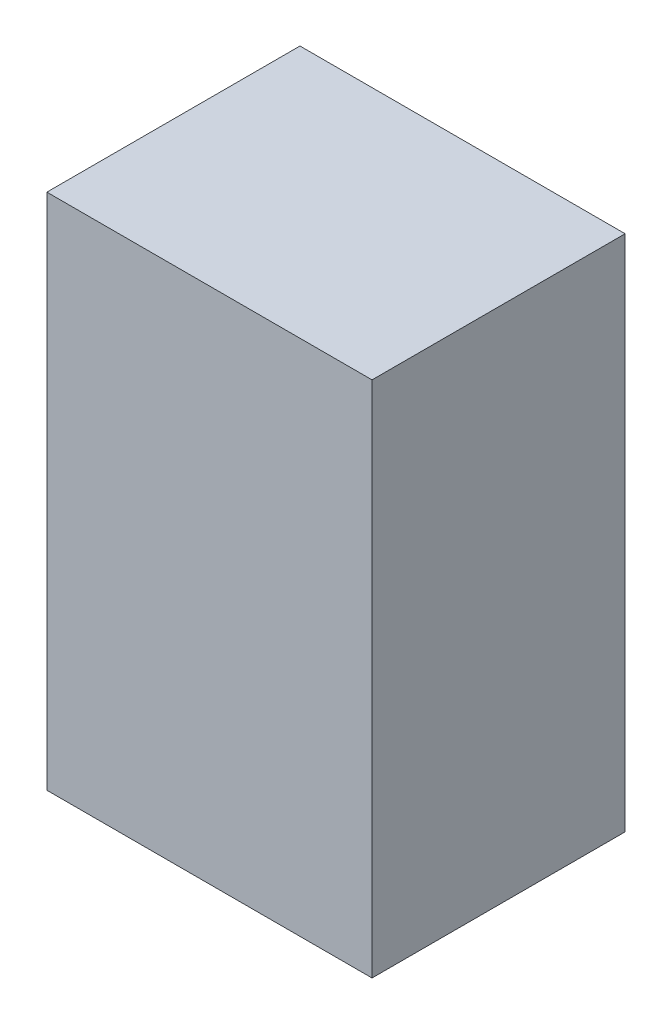
ISO-10303-21;
HEADER;
FILE_DESCRIPTION(('STEP AP214'),'2;1');
FILE_NAME('part.step','',(''),(''),'','','');
FILE_SCHEMA(('AUTOMOTIVE_DESIGN { 1 0 10303 214 1 1 1 1 }'));
ENDSEC;
DATA;
#1=APPLICATION_CONTEXT('core data for automotive mechanical design processes');
#2=APPLICATION_PROTOCOL_DEFINITION('international standard','automotive_design',2000,#1);
#3=PRODUCT_CONTEXT('',#1,'mechanical');
#4=PRODUCT('Part','Part','',(#3));
#5=PRODUCT_RELATED_PRODUCT_CATEGORY('part','',(#4));
#6=PRODUCT_DEFINITION_FORMATION('','',#4);
#7=PRODUCT_DEFINITION_CONTEXT('part definition',#1,'design');
#8=PRODUCT_DEFINITION('design','',#6,#7);
#9=PRODUCT_DEFINITION_SHAPE('','',#8);
#10=(LENGTH_UNIT() NAMED_UNIT(*) SI_UNIT(.MILLI.,.METRE.));
#11=(NAMED_UNIT(*) PLANE_ANGLE_UNIT() SI_UNIT($,.RADIAN.));
#12=(NAMED_UNIT(*) SI_UNIT($,.STERADIAN.) SOLID_ANGLE_UNIT());
#13=UNCERTAINTY_MEASURE_WITH_UNIT(LENGTH_MEASURE(1.E-05),#10,'distance_accuracy_value','');
#14=(GEOMETRIC_REPRESENTATION_CONTEXT(3) GLOBAL_UNCERTAINTY_ASSIGNED_CONTEXT((#13)) GLOBAL_UNIT_ASSIGNED_CONTEXT((#10,
#11,#12)) REPRESENTATION_CONTEXT('',''));
#15=CARTESIAN_POINT('',(0.,0.,0.));
#16=DIRECTION('',(0.,0.,1.));
#17=DIRECTION('',(1.,0.,0.));
#18=AXIS2_PLACEMENT_3D('',#15,#16,#17);
#19=CARTESIAN_POINT('',(0.67449192,-1.07448858,1.05000044));
#20=DIRECTION('',(0.,0.,1.));
#21=DIRECTION('',(1.,0.,0.));
#22=AXIS2_PLACEMENT_3D('',#19,#20,#21);
#23=PLANE('',#22);
#24=DIRECTION('',(0.,1.,0.));
#25=VECTOR('',#24,1.);
#26=CARTESIAN_POINT('',(-0.67449192,-1.07449112,1.05000044));
#27=LINE('',#26,#25);
#28=CARTESIAN_POINT('',(-0.67449192,-1.07449112,1.05000044));
#29=VERTEX_POINT('',#28);
#30=CARTESIAN_POINT('',(-0.67449192,1.07449366,1.05000044));
#31=VERTEX_POINT('',#30);
#32=EDGE_CURVE('E53',#29,#31,#27,.T.);
#33=ORIENTED_EDGE('',*,*,#32,.F.);
#34=DIRECTION('',(1.,0.,0.));
#35=VECTOR('',#34,1.);
#36=CARTESIAN_POINT('',(0.67449192,-1.07449112,1.05000044));
#37=LINE('',#36,#35);
#38=CARTESIAN_POINT('',(0.67449192,-1.07448985,1.05000044));
#39=VERTEX_POINT('',#38);
#40=EDGE_CURVE('E20',#29,#39,#37,.T.);
#41=ORIENTED_EDGE('',*,*,#40,.T.);
#42=DIRECTION('',(0.,1.,0.));
#43=VECTOR('',#42,1.);
#44=CARTESIAN_POINT('',(0.67449192,1.07449366,1.05000044));
#45=LINE('',#44,#43);
#46=CARTESIAN_POINT('',(0.67449192,1.07449366,1.05000044));
#47=VERTEX_POINT('',#46);
#48=EDGE_CURVE('E67',#47,#39,#45,.F.);
#49=ORIENTED_EDGE('',*,*,#48,.F.);
#50=DIRECTION('',(1.,0.,0.));
#51=VECTOR('',#50,1.);
#52=CARTESIAN_POINT('',(-0.67449192,1.07449366,1.05000044));
#53=LINE('',#52,#51);
#54=EDGE_CURVE('E58',#31,#47,#53,.T.);
#55=ORIENTED_EDGE('',*,*,#54,.F.);
#56=EDGE_LOOP('',(#33,#41,#49,#55));
#57=FACE_BOUND('',#56,.T.);
#58=ADVANCED_FACE('F17',(#57),#23,.T.);
#59=CARTESIAN_POINT('',(0.67449192,1.07449366,0.));
#60=DIRECTION('',(1.,0.,0.));
#61=DIRECTION('',(0.,0.,-1.));
#62=AXIS2_PLACEMENT_3D('',#59,#60,#61);
#63=PLANE('',#62);
#64=DIRECTION('',(0.,0.,1.));
#65=VECTOR('',#64,1.);
#66=CARTESIAN_POINT('',(0.67449192,-1.07448858,0.));
#67=LINE('',#66,#65);
#68=CARTESIAN_POINT('',(0.67449192,-1.074489215,0.));
#69=VERTEX_POINT('',#68);
#70=EDGE_CURVE('E80',#69,#39,#67,.T.);
#71=ORIENTED_EDGE('',*,*,#70,.F.);
#72=DIRECTION('',(0.,1.,0.));
#73=VECTOR('',#72,1.);
#74=CARTESIAN_POINT('',(0.67449192,-1.07448858,0.));
#75=LINE('',#74,#73);
#76=CARTESIAN_POINT('',(0.67449192,1.07449366,0.));
#77=VERTEX_POINT('',#76);
#78=EDGE_CURVE('E75',#69,#77,#75,.T.);
#79=ORIENTED_EDGE('',*,*,#78,.T.);
#80=DIRECTION('',(0.,0.,1.));
#81=VECTOR('',#80,1.);
#82=CARTESIAN_POINT('',(0.67449192,1.07449366,0.));
#83=LINE('',#82,#81);
#84=EDGE_CURVE('E63',#47,#77,#83,.F.);
#85=ORIENTED_EDGE('',*,*,#84,.F.);
#86=ORIENTED_EDGE('',*,*,#48,.T.);
#87=EDGE_LOOP('',(#71,#79,#85,#86));
#88=FACE_BOUND('',#87,.T.);
#89=ADVANCED_FACE('F74',(#88),#63,.T.);
#90=CARTESIAN_POINT('',(-0.67449192,1.07449366,0.));
#91=DIRECTION('',(0.,1.,0.));
#92=DIRECTION('',(0.,0.,1.));
#93=AXIS2_PLACEMENT_3D('',#90,#91,#92);
#94=PLANE('',#93);
#95=ORIENTED_EDGE('',*,*,#84,.T.);
#96=DIRECTION('',(1.,0.,0.));
#97=VECTOR('',#96,1.);
#98=CARTESIAN_POINT('',(0.67449192,1.07449366,0.));
#99=LINE('',#98,#97);
#100=CARTESIAN_POINT('',(-0.67449192,1.07449366,0.));
#101=VERTEX_POINT('',#100);
#102=EDGE_CURVE('E84',#77,#101,#99,.F.);
#103=ORIENTED_EDGE('',*,*,#102,.T.);
#104=DIRECTION('',(0.,0.,1.));
#105=VECTOR('',#104,1.);
#106=CARTESIAN_POINT('',(-0.67449192,1.07449366,0.));
#107=LINE('',#106,#105);
#108=EDGE_CURVE('E65',#31,#101,#107,.F.);
#109=ORIENTED_EDGE('',*,*,#108,.F.);
#110=ORIENTED_EDGE('',*,*,#54,.T.);
#111=EDGE_LOOP('',(#95,#103,#109,#110));
#112=FACE_BOUND('',#111,.T.);
#113=ADVANCED_FACE('F60',(#112),#94,.T.);
#114=CARTESIAN_POINT('',(-0.67449192,-1.07449112,0.));
#115=DIRECTION('',(-1.,0.,0.));
#116=DIRECTION('',(0.,0.,1.));
#117=AXIS2_PLACEMENT_3D('',#114,#115,#116);
#118=PLANE('',#117);
#119=ORIENTED_EDGE('',*,*,#108,.T.);
#120=DIRECTION('',(0.,1.,0.));
#121=VECTOR('',#120,1.);
#122=CARTESIAN_POINT('',(-0.67449192,-1.07448858,0.));
#123=LINE('',#122,#121);
#124=CARTESIAN_POINT('',(-0.67449192,-1.07449112,0.));
#125=VERTEX_POINT('',#124);
#126=EDGE_CURVE('E26',#101,#125,#123,.F.);
#127=ORIENTED_EDGE('',*,*,#126,.T.);
#128=DIRECTION('',(0.,0.,1.));
#129=VECTOR('',#128,1.);
#130=CARTESIAN_POINT('',(-0.67449192,-1.07449112,0.));
#131=LINE('',#130,#129);
#132=EDGE_CURVE('E34',#29,#125,#131,.F.);
#133=ORIENTED_EDGE('',*,*,#132,.F.);
#134=ORIENTED_EDGE('',*,*,#32,.T.);
#135=EDGE_LOOP('',(#119,#127,#133,#134));
#136=FACE_BOUND('',#135,.T.);
#137=ADVANCED_FACE('F88',(#136),#118,.T.);
#138=CARTESIAN_POINT('',(0.67449192,-1.07448858,0.));
#139=DIRECTION('',(1.88289875807143E-06,-0.999999999998227,0.));
#140=DIRECTION('',(0.999999999998227,1.88289875807143E-06,0.));
#141=AXIS2_PLACEMENT_3D('',#138,#139,#140);
#142=PLANE('',#141);
#143=ORIENTED_EDGE('',*,*,#132,.T.);
#144=DIRECTION('',(1.,0.,0.));
#145=VECTOR('',#144,1.);
#146=CARTESIAN_POINT('',(0.67449192,-1.07449112,0.));
#147=LINE('',#146,#145);
#148=EDGE_CURVE('E11',#125,#69,#147,.T.);
#149=ORIENTED_EDGE('',*,*,#148,.T.);
#150=ORIENTED_EDGE('',*,*,#70,.T.);
#151=ORIENTED_EDGE('',*,*,#40,.F.);
#152=EDGE_LOOP('',(#143,#149,#150,#151));
#153=FACE_BOUND('',#152,.T.);
#154=ADVANCED_FACE('F91',(#153),#142,.T.);
#155=CARTESIAN_POINT('',(0.67449192,-1.07448858,0.));
#156=DIRECTION('',(0.,0.,1.));
#157=DIRECTION('',(1.,0.,0.));
#158=AXIS2_PLACEMENT_3D('',#155,#156,#157);
#159=PLANE('',#158);
#160=ORIENTED_EDGE('',*,*,#126,.F.);
#161=ORIENTED_EDGE('',*,*,#102,.F.);
#162=ORIENTED_EDGE('',*,*,#78,.F.);
#163=ORIENTED_EDGE('',*,*,#148,.F.);
#164=EDGE_LOOP('',(#160,#161,#162,#163));
#165=FACE_BOUND('',#164,.T.);
#166=ADVANCED_FACE('F90',(#165),#159,.F.);
#167=CLOSED_SHELL('',(#58,#89,#113,#137,#154,#166));
#168=MANIFOLD_SOLID_BREP('B1',#167);
#169=ADVANCED_BREP_SHAPE_REPRESENTATION('',(#18,#168),#14);
#170=SHAPE_DEFINITION_REPRESENTATION(#9,#169);
ENDSEC;
END-ISO-10303-21;
